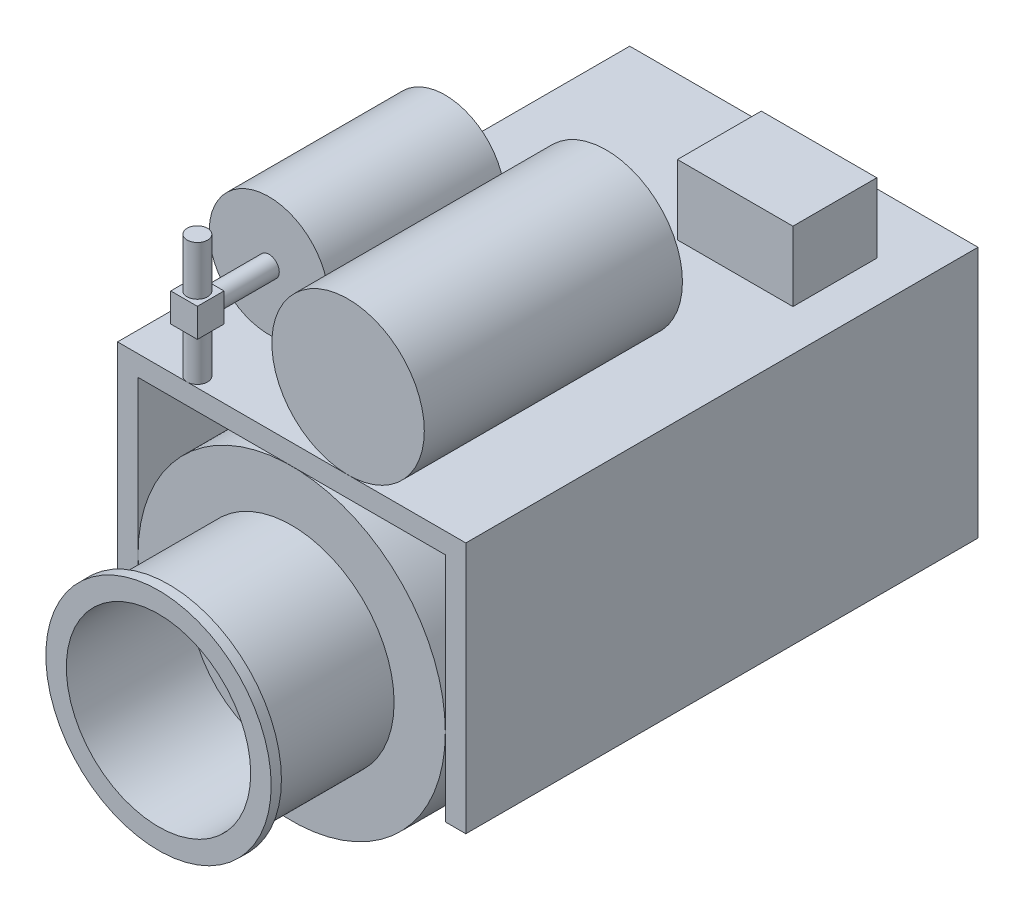
ISO-10303-21;
HEADER;
FILE_DESCRIPTION(('STEP AP214'),'2;1');
FILE_NAME('part.step','',(''),(''),'','','');
FILE_SCHEMA(('AUTOMOTIVE_DESIGN { 1 0 10303 214 1 1 1 1 }'));
ENDSEC;
DATA;
#1=APPLICATION_CONTEXT('core data for automotive mechanical design processes');
#2=APPLICATION_PROTOCOL_DEFINITION('international standard','automotive_design',2000,#1);
#3=PRODUCT_CONTEXT('',#1,'mechanical');
#4=PRODUCT('Part','Part','',(#3));
#5=PRODUCT_RELATED_PRODUCT_CATEGORY('part','',(#4));
#6=PRODUCT_DEFINITION_FORMATION('','',#4);
#7=PRODUCT_DEFINITION_CONTEXT('part definition',#1,'design');
#8=PRODUCT_DEFINITION('design','',#6,#7);
#9=PRODUCT_DEFINITION_SHAPE('','',#8);
#10=(LENGTH_UNIT() NAMED_UNIT(*) SI_UNIT(.MILLI.,.METRE.));
#11=(NAMED_UNIT(*) PLANE_ANGLE_UNIT() SI_UNIT($,.RADIAN.));
#12=(NAMED_UNIT(*) SI_UNIT($,.STERADIAN.) SOLID_ANGLE_UNIT());
#13=UNCERTAINTY_MEASURE_WITH_UNIT(LENGTH_MEASURE(1.E-05),#10,'distance_accuracy_value','');
#14=(GEOMETRIC_REPRESENTATION_CONTEXT(3) GLOBAL_UNCERTAINTY_ASSIGNED_CONTEXT((#13)) GLOBAL_UNIT_ASSIGNED_CONTEXT((#10,
#11,#12)) REPRESENTATION_CONTEXT('',''));
#15=CARTESIAN_POINT('',(0.,0.,0.));
#16=DIRECTION('',(0.,0.,1.));
#17=DIRECTION('',(1.,0.,0.));
#18=AXIS2_PLACEMENT_3D('',#15,#16,#17);
#19=CARTESIAN_POINT('',(-51.1131940651124,114.167789900578,-191.));
#20=DIRECTION('',(0.,0.,1.));
#21=DIRECTION('',(1.,0.,0.));
#22=AXIS2_PLACEMENT_3D('',#19,#20,#21);
#23=CYLINDRICAL_SURFACE('',#22,29.1633630047708);
#24=CARTESIAN_POINT('',(-51.1131940651124,114.167789900578,-191.));
#25=DIRECTION('',(0.,0.,1.));
#26=DIRECTION('',(1.,0.,0.));
#27=AXIS2_PLACEMENT_3D('',#24,#25,#26);
#28=CIRCLE('',#27,29.1633630047708);
#29=CARTESIAN_POINT('',(-21.9498310603416,114.167789900578,-191.));
#30=VERTEX_POINT('',#29);
#31=EDGE_CURVE('E54',#30,#30,#28,.T.);
#32=ORIENTED_EDGE('',*,*,#31,.T.);
#33=EDGE_LOOP('',(#32));
#34=FACE_BOUND('',#33,.T.);
#35=CARTESIAN_POINT('',(-51.1131940651124,114.167789900578,-105.));
#36=DIRECTION('',(0.,0.,1.));
#37=DIRECTION('',(1.,0.,0.));
#38=AXIS2_PLACEMENT_3D('',#35,#36,#37);
#39=CIRCLE('',#38,29.1633630047708);
#40=CARTESIAN_POINT('',(-21.9498310603416,114.167789900578,-105.));
#41=VERTEX_POINT('',#40);
#42=EDGE_CURVE('E49',#41,#41,#39,.T.);
#43=ORIENTED_EDGE('',*,*,#42,.F.);
#44=EDGE_LOOP('',(#43));
#45=FACE_BOUND('',#44,.T.);
#46=ADVANCED_FACE('F46',(#34,#45),#23,.T.);
#47=CARTESIAN_POINT('',(-51.1131940651124,114.167789900578,-191.));
#48=DIRECTION('',(0.,0.,1.));
#49=DIRECTION('',(1.,0.,0.));
#50=AXIS2_PLACEMENT_3D('',#47,#48,#49);
#51=PLANE('',#50);
#52=ORIENTED_EDGE('',*,*,#31,.F.);
#53=EDGE_LOOP('',(#52));
#54=FACE_BOUND('',#53,.T.);
#55=ADVANCED_FACE('F212',(#54),#51,.F.);
#56=CARTESIAN_POINT('',(-51.1131940651124,114.167789900578,-105.));
#57=DIRECTION('',(0.,0.,1.));
#58=DIRECTION('',(1.,0.,0.));
#59=AXIS2_PLACEMENT_3D('',#56,#57,#58);
#60=PLANE('',#59);
#61=CARTESIAN_POINT('',(-51.0528965168359,114.,-105.));
#62=DIRECTION('',(0.,0.,1.));
#63=DIRECTION('',(1.,0.,0.));
#64=AXIS2_PLACEMENT_3D('',#61,#62,#63);
#65=CIRCLE('',#64,5.);
#66=CARTESIAN_POINT('',(-46.0528965168359,114.,-105.));
#67=VERTEX_POINT('',#66);
#68=EDGE_CURVE('E12',#67,#67,#65,.T.);
#69=ORIENTED_EDGE('',*,*,#68,.F.);
#70=EDGE_LOOP('',(#69));
#71=FACE_BOUND('',#70,.T.);
#72=ORIENTED_EDGE('',*,*,#42,.T.);
#73=EDGE_LOOP('',(#72));
#74=FACE_BOUND('',#73,.T.);
#75=ADVANCED_FACE('F209',(#71,#74),#60,.T.);
#76=CARTESIAN_POINT('',(-51.0528965168359,114.,-119.142135623731));
#77=DIRECTION('',(0.,0.,1.));
#78=DIRECTION('',(1.,0.,0.));
#79=AXIS2_PLACEMENT_3D('',#76,#77,#78);
#80=CYLINDRICAL_SURFACE('',#79,5.);
#81=ORIENTED_EDGE('',*,*,#68,.T.);
#82=EDGE_LOOP('',(#81));
#83=FACE_BOUND('',#82,.T.);
#84=CARTESIAN_POINT('',(-51.0528965168359,114.,-76.52));
#85=DIRECTION('',(0.,0.,-1.));
#86=DIRECTION('',(-1.,0.,0.));
#87=AXIS2_PLACEMENT_3D('',#84,#85,#86);
#88=CIRCLE('',#87,5.);
#89=CARTESIAN_POINT('',(-56.0528965168359,114.,-76.52));
#90=VERTEX_POINT('',#89);
#91=EDGE_CURVE('E201',#90,#90,#88,.T.);
#92=ORIENTED_EDGE('',*,*,#91,.T.);
#93=EDGE_LOOP('',(#92));
#94=FACE_BOUND('',#93,.T.);
#95=ADVANCED_FACE('F221',(#83,#94),#80,.T.);
#96=CARTESIAN_POINT('',(85.,85.,-315.));
#97=DIRECTION('',(0.,1.,0.));
#98=DIRECTION('',(0.,0.,1.));
#99=AXIS2_PLACEMENT_3D('',#96,#97,#98);
#100=PLANE('',#99);
#101=CARTESIAN_POINT('',(-51.0528965168359,85.,-70.02));
#102=DIRECTION('',(0.,1.,0.));
#103=DIRECTION('',(0.,0.,1.));
#104=AXIS2_PLACEMENT_3D('',#101,#102,#103);
#105=CIRCLE('',#104,5.);
#106=CARTESIAN_POINT('',(-51.0528965168359,85.,-75.02));
#107=VERTEX_POINT('',#106);
#108=EDGE_CURVE('E197',#107,#107,#105,.T.);
#109=ORIENTED_EDGE('',*,*,#108,.F.);
#110=EDGE_LOOP('',(#109));
#111=FACE_BOUND('',#110,.T.);
#112=DIRECTION('',(0.,0.,1.));
#113=VECTOR('',#112,1.);
#114=CARTESIAN_POINT('',(-85.,85.,-315.));
#115=LINE('',#114,#113);
#116=CARTESIAN_POINT('',(-85.,85.,-315.));
#117=VERTEX_POINT('',#116);
#118=CARTESIAN_POINT('',(-85.,85.,-65.));
#119=VERTEX_POINT('',#118);
#120=EDGE_CURVE('E186',#117,#119,#115,.T.);
#121=ORIENTED_EDGE('',*,*,#120,.T.);
#122=DIRECTION('',(-1.,0.,0.));
#123=VECTOR('',#122,1.);
#124=CARTESIAN_POINT('',(85.,85.,-65.));
#125=LINE('',#124,#123);
#126=CARTESIAN_POINT('',(85.,85.,-65.));
#127=VERTEX_POINT('',#126);
#128=EDGE_CURVE('E170',#127,#119,#125,.T.);
#129=ORIENTED_EDGE('',*,*,#128,.F.);
#130=DIRECTION('',(0.,0.,1.));
#131=VECTOR('',#130,1.);
#132=CARTESIAN_POINT('',(85.,85.,-315.));
#133=LINE('',#132,#131);
#134=CARTESIAN_POINT('',(85.,85.,-315.));
#135=VERTEX_POINT('',#134);
#136=EDGE_CURVE('E189',#135,#127,#133,.T.);
#137=ORIENTED_EDGE('',*,*,#136,.F.);
#138=DIRECTION('',(-1.,0.,0.));
#139=VECTOR('',#138,1.);
#140=CARTESIAN_POINT('',(85.,85.,-315.));
#141=LINE('',#140,#139);
#142=EDGE_CURVE('E155',#135,#117,#141,.T.);
#143=ORIENTED_EDGE('',*,*,#142,.T.);
#144=EDGE_LOOP('',(#121,#129,#137,#143));
#145=FACE_BOUND('',#144,.T.);
#146=DIRECTION('',(1.,0.,0.));
#147=VECTOR('',#146,1.);
#148=CARTESIAN_POINT('',(8.55614973262083,85.,-244.739173744364));
#149=LINE('',#148,#147);
#150=CARTESIAN_POINT('',(8.55614973262083,85.,-244.739173744364));
#151=VERTEX_POINT('',#150);
#152=CARTESIAN_POINT('',(64.9260773828261,85.,-244.739173744364));
#153=VERTEX_POINT('',#152);
#154=EDGE_CURVE('E386',#151,#153,#149,.T.);
#155=ORIENTED_EDGE('',*,*,#154,.F.);
#156=DIRECTION('',(0.,0.,1.));
#157=VECTOR('',#156,1.);
#158=CARTESIAN_POINT('',(8.55614973262083,85.,-244.739173744364));
#159=LINE('',#158,#157);
#160=CARTESIAN_POINT('',(8.55614973262083,85.,-285.674478347489));
#161=VERTEX_POINT('',#160);
#162=EDGE_CURVE('E367',#161,#151,#159,.T.);
#163=ORIENTED_EDGE('',*,*,#162,.F.);
#164=DIRECTION('',(-1.,0.,0.));
#165=VECTOR('',#164,1.);
#166=CARTESIAN_POINT('',(8.55614973262083,85.,-285.674478347489));
#167=LINE('',#166,#165);
#168=CARTESIAN_POINT('',(64.9260773828261,85.,-285.674478347489));
#169=VERTEX_POINT('',#168);
#170=EDGE_CURVE('E374',#169,#161,#167,.T.);
#171=ORIENTED_EDGE('',*,*,#170,.F.);
#172=DIRECTION('',(0.,0.,-1.));
#173=VECTOR('',#172,1.);
#174=CARTESIAN_POINT('',(64.9260773828261,85.,-244.739173744364));
#175=LINE('',#174,#173);
#176=EDGE_CURVE('E389',#153,#169,#175,.T.);
#177=ORIENTED_EDGE('',*,*,#176,.F.);
#178=EDGE_LOOP('',(#155,#163,#171,#177));
#179=FACE_BOUND('',#178,.T.);
#180=ADVANCED_FACE('F226',(#111,#145,#179),#100,.T.);
#181=CARTESIAN_POINT('',(75.,-37.9427434180125,-315.));
#182=DIRECTION('',(-1.,0.,0.));
#183=DIRECTION('',(0.,0.,1.));
#184=AXIS2_PLACEMENT_3D('',#181,#182,#183);
#185=PLANE('',#184);
#186=DIRECTION('',(0.,-1.,0.));
#187=VECTOR('',#186,1.);
#188=CARTESIAN_POINT('',(75.,-37.9427434180125,-65.));
#189=LINE('',#188,#187);
#190=CARTESIAN_POINT('',(75.,75.,-65.));
#191=VERTEX_POINT('',#190);
#192=CARTESIAN_POINT('',(75.,-37.9427434180125,-65.));
#193=VERTEX_POINT('',#192);
#194=EDGE_CURVE('E160',#191,#193,#189,.T.);
#195=ORIENTED_EDGE('',*,*,#194,.F.);
#196=DIRECTION('',(0.,0.,1.));
#197=VECTOR('',#196,1.);
#198=CARTESIAN_POINT('',(75.,75.,-315.));
#199=LINE('',#198,#197);
#200=CARTESIAN_POINT('',(75.,75.,-315.));
#201=VERTEX_POINT('',#200);
#202=EDGE_CURVE('E71',#201,#191,#199,.T.);
#203=ORIENTED_EDGE('',*,*,#202,.F.);
#204=DIRECTION('',(0.,-1.,0.));
#205=VECTOR('',#204,1.);
#206=CARTESIAN_POINT('',(75.,-37.9427434180125,-315.));
#207=LINE('',#206,#205);
#208=CARTESIAN_POINT('',(75.,-37.9427434180125,-315.));
#209=VERTEX_POINT('',#208);
#210=EDGE_CURVE('E181',#201,#209,#207,.T.);
#211=ORIENTED_EDGE('',*,*,#210,.T.);
#212=DIRECTION('',(0.,0.,1.));
#213=VECTOR('',#212,1.);
#214=CARTESIAN_POINT('',(75.,-37.9427434180125,-315.));
#215=LINE('',#214,#213);
#216=EDGE_CURVE('E110',#209,#193,#215,.T.);
#217=ORIENTED_EDGE('',*,*,#216,.T.);
#218=EDGE_LOOP('',(#195,#203,#211,#217));
#219=FACE_BOUND('',#218,.T.);
#220=ADVANCED_FACE('F228',(#219),#185,.T.);
#221=CARTESIAN_POINT('',(75.,75.,-315.));
#222=DIRECTION('',(0.,-1.,0.));
#223=DIRECTION('',(0.,0.,-1.));
#224=AXIS2_PLACEMENT_3D('',#221,#222,#223);
#225=PLANE('',#224);
#226=DIRECTION('',(1.,0.,0.));
#227=VECTOR('',#226,1.);
#228=CARTESIAN_POINT('',(75.,75.,-65.));
#229=LINE('',#228,#227);
#230=CARTESIAN_POINT('',(-75.,75.,-65.));
#231=VERTEX_POINT('',#230);
#232=EDGE_CURVE('E178',#231,#191,#229,.T.);
#233=ORIENTED_EDGE('',*,*,#232,.F.);
#234=DIRECTION('',(0.,0.,1.));
#235=VECTOR('',#234,1.);
#236=CARTESIAN_POINT('',(-75.,75.,-315.));
#237=LINE('',#236,#235);
#238=CARTESIAN_POINT('',(-75.,75.,-315.));
#239=VERTEX_POINT('',#238);
#240=EDGE_CURVE('E141',#239,#231,#237,.T.);
#241=ORIENTED_EDGE('',*,*,#240,.F.);
#242=DIRECTION('',(1.,0.,0.));
#243=VECTOR('',#242,1.);
#244=CARTESIAN_POINT('',(75.,75.,-315.));
#245=LINE('',#244,#243);
#246=EDGE_CURVE('E150',#239,#201,#245,.T.);
#247=ORIENTED_EDGE('',*,*,#246,.T.);
#248=ORIENTED_EDGE('',*,*,#202,.T.);
#249=EDGE_LOOP('',(#233,#241,#247,#248));
#250=FACE_BOUND('',#249,.T.);
#251=ADVANCED_FACE('F231',(#250),#225,.T.);
#252=CARTESIAN_POINT('',(-75.,75.,-315.));
#253=DIRECTION('',(1.,0.,0.));
#254=DIRECTION('',(0.,0.,-1.));
#255=AXIS2_PLACEMENT_3D('',#252,#253,#254);
#256=PLANE('',#255);
#257=DIRECTION('',(0.,1.,0.));
#258=VECTOR('',#257,1.);
#259=CARTESIAN_POINT('',(-75.,75.,-65.));
#260=LINE('',#259,#258);
#261=CARTESIAN_POINT('',(-75.,-37.9427434180125,-65.));
#262=VERTEX_POINT('',#261);
#263=EDGE_CURVE('E136',#262,#231,#260,.T.);
#264=ORIENTED_EDGE('',*,*,#263,.F.);
#265=DIRECTION('',(0.,0.,1.));
#266=VECTOR('',#265,1.);
#267=CARTESIAN_POINT('',(-75.,-37.9427434180125,-315.));
#268=LINE('',#267,#266);
#269=CARTESIAN_POINT('',(-75.,-37.9427434180125,-315.));
#270=VERTEX_POINT('',#269);
#271=EDGE_CURVE('E130',#270,#262,#268,.T.);
#272=ORIENTED_EDGE('',*,*,#271,.F.);
#273=DIRECTION('',(0.,1.,0.));
#274=VECTOR('',#273,1.);
#275=CARTESIAN_POINT('',(-75.,75.,-315.));
#276=LINE('',#275,#274);
#277=EDGE_CURVE('E133',#270,#239,#276,.T.);
#278=ORIENTED_EDGE('',*,*,#277,.T.);
#279=ORIENTED_EDGE('',*,*,#240,.T.);
#280=EDGE_LOOP('',(#264,#272,#278,#279));
#281=FACE_BOUND('',#280,.T.);
#282=ADVANCED_FACE('F132',(#281),#256,.T.);
#283=CARTESIAN_POINT('',(-75.,-37.9427434180125,-315.));
#284=DIRECTION('',(0.,-1.,0.));
#285=DIRECTION('',(0.,0.,-1.));
#286=AXIS2_PLACEMENT_3D('',#283,#284,#285);
#287=PLANE('',#286);
#288=DIRECTION('',(1.,0.,0.));
#289=VECTOR('',#288,1.);
#290=CARTESIAN_POINT('',(-75.,-37.9427434180125,-65.));
#291=LINE('',#290,#289);
#292=CARTESIAN_POINT('',(-85.,-37.9427434180125,-65.));
#293=VERTEX_POINT('',#292);
#294=EDGE_CURVE('E175',#293,#262,#291,.T.);
#295=ORIENTED_EDGE('',*,*,#294,.F.);
#296=DIRECTION('',(0.,0.,1.));
#297=VECTOR('',#296,1.);
#298=CARTESIAN_POINT('',(-85.,-37.9427434180125,-315.));
#299=LINE('',#298,#297);
#300=CARTESIAN_POINT('',(-85.,-37.9427434180125,-315.));
#301=VERTEX_POINT('',#300);
#302=EDGE_CURVE('E142',#301,#293,#299,.T.);
#303=ORIENTED_EDGE('',*,*,#302,.F.);
#304=DIRECTION('',(1.,0.,0.));
#305=VECTOR('',#304,1.);
#306=CARTESIAN_POINT('',(-75.,-37.9427434180125,-315.));
#307=LINE('',#306,#305);
#308=EDGE_CURVE('E148',#301,#270,#307,.T.);
#309=ORIENTED_EDGE('',*,*,#308,.T.);
#310=ORIENTED_EDGE('',*,*,#271,.T.);
#311=EDGE_LOOP('',(#295,#303,#309,#310));
#312=FACE_BOUND('',#311,.T.);
#313=ADVANCED_FACE('F152',(#312),#287,.T.);
#314=CARTESIAN_POINT('',(-85.,85.,-315.));
#315=DIRECTION('',(-1.,0.,0.));
#316=DIRECTION('',(0.,0.,1.));
#317=AXIS2_PLACEMENT_3D('',#314,#315,#316);
#318=PLANE('',#317);
#319=DIRECTION('',(0.,-1.,0.));
#320=VECTOR('',#319,1.);
#321=CARTESIAN_POINT('',(-85.,85.,-65.));
#322=LINE('',#321,#320);
#323=EDGE_CURVE('E172',#119,#293,#322,.T.);
#324=ORIENTED_EDGE('',*,*,#323,.F.);
#325=ORIENTED_EDGE('',*,*,#120,.F.);
#326=DIRECTION('',(0.,-1.,0.));
#327=VECTOR('',#326,1.);
#328=CARTESIAN_POINT('',(-85.,85.,-315.));
#329=LINE('',#328,#327);
#330=EDGE_CURVE('E153',#117,#301,#329,.T.);
#331=ORIENTED_EDGE('',*,*,#330,.T.);
#332=ORIENTED_EDGE('',*,*,#302,.T.);
#333=EDGE_LOOP('',(#324,#325,#331,#332));
#334=FACE_BOUND('',#333,.T.);
#335=ADVANCED_FACE('F238',(#334),#318,.T.);
#336=CARTESIAN_POINT('',(85.,-37.9427434180125,-315.));
#337=DIRECTION('',(1.,0.,0.));
#338=DIRECTION('',(0.,0.,-1.));
#339=AXIS2_PLACEMENT_3D('',#336,#337,#338);
#340=PLANE('',#339);
#341=DIRECTION('',(0.,1.,0.));
#342=VECTOR('',#341,1.);
#343=CARTESIAN_POINT('',(85.,-37.9427434180125,-65.));
#344=LINE('',#343,#342);
#345=CARTESIAN_POINT('',(85.,-37.9427434180125,-65.));
#346=VERTEX_POINT('',#345);
#347=EDGE_CURVE('E167',#346,#127,#344,.T.);
#348=ORIENTED_EDGE('',*,*,#347,.F.);
#349=DIRECTION('',(0.,0.,1.));
#350=VECTOR('',#349,1.);
#351=CARTESIAN_POINT('',(85.,-37.9427434180125,-315.));
#352=LINE('',#351,#350);
#353=CARTESIAN_POINT('',(85.,-37.9427434180125,-315.));
#354=VERTEX_POINT('',#353);
#355=EDGE_CURVE('E191',#354,#346,#352,.T.);
#356=ORIENTED_EDGE('',*,*,#355,.F.);
#357=DIRECTION('',(0.,1.,0.));
#358=VECTOR('',#357,1.);
#359=CARTESIAN_POINT('',(85.,-37.9427434180125,-315.));
#360=LINE('',#359,#358);
#361=EDGE_CURVE('E403',#354,#135,#360,.T.);
#362=ORIENTED_EDGE('',*,*,#361,.T.);
#363=ORIENTED_EDGE('',*,*,#136,.T.);
#364=EDGE_LOOP('',(#348,#356,#362,#363));
#365=FACE_BOUND('',#364,.T.);
#366=ADVANCED_FACE('F235',(#365),#340,.T.);
#367=CARTESIAN_POINT('',(75.,-37.9427434180125,-315.));
#368=DIRECTION('',(0.,-1.,0.));
#369=DIRECTION('',(0.,0.,-1.));
#370=AXIS2_PLACEMENT_3D('',#367,#368,#369);
#371=PLANE('',#370);
#372=DIRECTION('',(1.,0.,0.));
#373=VECTOR('',#372,1.);
#374=CARTESIAN_POINT('',(75.,-37.9427434180125,-65.));
#375=LINE('',#374,#373);
#376=EDGE_CURVE('E163',#193,#346,#375,.T.);
#377=ORIENTED_EDGE('',*,*,#376,.F.);
#378=ORIENTED_EDGE('',*,*,#216,.F.);
#379=DIRECTION('',(1.,0.,0.));
#380=VECTOR('',#379,1.);
#381=CARTESIAN_POINT('',(75.,-37.9427434180125,-315.));
#382=LINE('',#381,#380);
#383=EDGE_CURVE('E401',#209,#354,#382,.T.);
#384=ORIENTED_EDGE('',*,*,#383,.T.);
#385=ORIENTED_EDGE('',*,*,#355,.T.);
#386=EDGE_LOOP('',(#377,#378,#384,#385));
#387=FACE_BOUND('',#386,.T.);
#388=ADVANCED_FACE('F232',(#387),#371,.T.);
#389=CARTESIAN_POINT('',(0.,0.,-315.));
#390=DIRECTION('',(0.,0.,1.));
#391=DIRECTION('',(1.,0.,0.));
#392=AXIS2_PLACEMENT_3D('',#389,#390,#391);
#393=PLANE('',#392);
#394=ORIENTED_EDGE('',*,*,#210,.F.);
#395=ORIENTED_EDGE('',*,*,#246,.F.);
#396=ORIENTED_EDGE('',*,*,#277,.F.);
#397=ORIENTED_EDGE('',*,*,#308,.F.);
#398=ORIENTED_EDGE('',*,*,#330,.F.);
#399=ORIENTED_EDGE('',*,*,#142,.F.);
#400=ORIENTED_EDGE('',*,*,#361,.F.);
#401=ORIENTED_EDGE('',*,*,#383,.F.);
#402=EDGE_LOOP('',(#394,#395,#396,#397,#398,#399,#400,#401));
#403=FACE_BOUND('',#402,.T.);
#404=ADVANCED_FACE('F146',(#403),#393,.F.);
#405=CARTESIAN_POINT('',(0.,0.,-65.));
#406=DIRECTION('',(0.,0.,1.));
#407=DIRECTION('',(1.,0.,0.));
#408=AXIS2_PLACEMENT_3D('',#405,#406,#407);
#409=PLANE('',#408);
#410=ORIENTED_EDGE('',*,*,#194,.T.);
#411=ORIENTED_EDGE('',*,*,#376,.T.);
#412=ORIENTED_EDGE('',*,*,#347,.T.);
#413=ORIENTED_EDGE('',*,*,#128,.T.);
#414=ORIENTED_EDGE('',*,*,#323,.T.);
#415=ORIENTED_EDGE('',*,*,#294,.T.);
#416=ORIENTED_EDGE('',*,*,#263,.T.);
#417=ORIENTED_EDGE('',*,*,#232,.T.);
#418=EDGE_LOOP('',(#410,#411,#412,#413,#414,#415,#416,#417));
#419=FACE_BOUND('',#418,.T.);
#420=ADVANCED_FACE('F252',(#419),#409,.T.);
#421=CARTESIAN_POINT('',(8.55614973262083,119.,-244.739173744364));
#422=DIRECTION('',(1.,0.,0.));
#423=DIRECTION('',(0.,0.,-1.));
#424=AXIS2_PLACEMENT_3D('',#421,#422,#423);
#425=PLANE('',#424);
#426=ORIENTED_EDGE('',*,*,#162,.T.);
#427=DIRECTION('',(0.,-1.,0.));
#428=VECTOR('',#427,1.);
#429=CARTESIAN_POINT('',(8.55614973262083,119.,-244.739173744364));
#430=LINE('',#429,#428);
#431=CARTESIAN_POINT('',(8.55614973262083,119.,-244.739173744364));
#432=VERTEX_POINT('',#431);
#433=EDGE_CURVE('E164',#432,#151,#430,.T.);
#434=ORIENTED_EDGE('',*,*,#433,.F.);
#435=DIRECTION('',(0.,0.,1.));
#436=VECTOR('',#435,1.);
#437=CARTESIAN_POINT('',(8.55614973262083,119.,-244.739173744364));
#438=LINE('',#437,#436);
#439=CARTESIAN_POINT('',(8.55614973262083,119.,-285.674478347489));
#440=VERTEX_POINT('',#439);
#441=EDGE_CURVE('E370',#440,#432,#438,.T.);
#442=ORIENTED_EDGE('',*,*,#441,.F.);
#443=DIRECTION('',(0.,-1.,0.));
#444=VECTOR('',#443,1.);
#445=CARTESIAN_POINT('',(8.55614973262083,119.,-285.674478347489));
#446=LINE('',#445,#444);
#447=EDGE_CURVE('E383',#440,#161,#446,.T.);
#448=ORIENTED_EDGE('',*,*,#447,.T.);
#449=EDGE_LOOP('',(#426,#434,#442,#448));
#450=FACE_BOUND('',#449,.T.);
#451=ADVANCED_FACE('F255',(#450),#425,.F.);
#452=CARTESIAN_POINT('',(8.55614973262083,119.,-244.739173744364));
#453=DIRECTION('',(0.,0.,-1.));
#454=DIRECTION('',(-1.,0.,0.));
#455=AXIS2_PLACEMENT_3D('',#452,#453,#454);
#456=PLANE('',#455);
#457=ORIENTED_EDGE('',*,*,#154,.T.);
#458=DIRECTION('',(0.,-1.,0.));
#459=VECTOR('',#458,1.);
#460=CARTESIAN_POINT('',(64.9260773828261,119.,-244.739173744364));
#461=LINE('',#460,#459);
#462=CARTESIAN_POINT('',(64.9260773828261,119.,-244.739173744364));
#463=VERTEX_POINT('',#462);
#464=EDGE_CURVE('E395',#463,#153,#461,.T.);
#465=ORIENTED_EDGE('',*,*,#464,.F.);
#466=DIRECTION('',(1.,0.,0.));
#467=VECTOR('',#466,1.);
#468=CARTESIAN_POINT('',(8.55614973262083,119.,-244.739173744364));
#469=LINE('',#468,#467);
#470=EDGE_CURVE('E373',#432,#463,#469,.T.);
#471=ORIENTED_EDGE('',*,*,#470,.F.);
#472=ORIENTED_EDGE('',*,*,#433,.T.);
#473=EDGE_LOOP('',(#457,#465,#471,#472));
#474=FACE_BOUND('',#473,.T.);
#475=ADVANCED_FACE('F261',(#474),#456,.F.);
#476=CARTESIAN_POINT('',(64.9260773828261,119.,-244.739173744364));
#477=DIRECTION('',(-1.,0.,0.));
#478=DIRECTION('',(0.,0.,1.));
#479=AXIS2_PLACEMENT_3D('',#476,#477,#478);
#480=PLANE('',#479);
#481=ORIENTED_EDGE('',*,*,#176,.T.);
#482=DIRECTION('',(0.,-1.,0.));
#483=VECTOR('',#482,1.);
#484=CARTESIAN_POINT('',(64.9260773828261,119.,-285.674478347489));
#485=LINE('',#484,#483);
#486=CARTESIAN_POINT('',(64.9260773828261,119.,-285.674478347489));
#487=VERTEX_POINT('',#486);
#488=EDGE_CURVE('E62',#487,#169,#485,.T.);
#489=ORIENTED_EDGE('',*,*,#488,.F.);
#490=DIRECTION('',(0.,0.,-1.));
#491=VECTOR('',#490,1.);
#492=CARTESIAN_POINT('',(64.9260773828261,119.,-244.739173744364));
#493=LINE('',#492,#491);
#494=EDGE_CURVE('E377',#463,#487,#493,.T.);
#495=ORIENTED_EDGE('',*,*,#494,.F.);
#496=ORIENTED_EDGE('',*,*,#464,.T.);
#497=EDGE_LOOP('',(#481,#489,#495,#496));
#498=FACE_BOUND('',#497,.T.);
#499=ADVANCED_FACE('F265',(#498),#480,.F.);
#500=CARTESIAN_POINT('',(8.55614973262083,119.,-285.674478347489));
#501=DIRECTION('',(0.,0.,1.));
#502=DIRECTION('',(1.,0.,0.));
#503=AXIS2_PLACEMENT_3D('',#500,#501,#502);
#504=PLANE('',#503);
#505=ORIENTED_EDGE('',*,*,#170,.T.);
#506=ORIENTED_EDGE('',*,*,#447,.F.);
#507=DIRECTION('',(-1.,0.,0.));
#508=VECTOR('',#507,1.);
#509=CARTESIAN_POINT('',(8.55614973262083,119.,-285.674478347489));
#510=LINE('',#509,#508);
#511=EDGE_CURVE('E380',#487,#440,#510,.T.);
#512=ORIENTED_EDGE('',*,*,#511,.F.);
#513=ORIENTED_EDGE('',*,*,#488,.T.);
#514=EDGE_LOOP('',(#505,#506,#512,#513));
#515=FACE_BOUND('',#514,.T.);
#516=ADVANCED_FACE('F269',(#515),#504,.F.);
#517=CARTESIAN_POINT('',(0.,119.,0.));
#518=DIRECTION('',(0.,-1.,0.));
#519=DIRECTION('',(0.,0.,-1.));
#520=AXIS2_PLACEMENT_3D('',#517,#518,#519);
#521=PLANE('',#520);
#522=ORIENTED_EDGE('',*,*,#441,.T.);
#523=ORIENTED_EDGE('',*,*,#470,.T.);
#524=ORIENTED_EDGE('',*,*,#494,.T.);
#525=ORIENTED_EDGE('',*,*,#511,.T.);
#526=EDGE_LOOP('',(#522,#523,#524,#525));
#527=FACE_BOUND('',#526,.T.);
#528=ADVANCED_FACE('F273',(#527),#521,.F.);
#529=CARTESIAN_POINT('',(-51.0528965168359,145.,-70.02));
#530=DIRECTION('',(0.,-1.,0.));
#531=DIRECTION('',(0.,0.,-1.));
#532=AXIS2_PLACEMENT_3D('',#529,#530,#531);
#533=CYLINDRICAL_SURFACE('',#532,5.);
#534=CARTESIAN_POINT('',(-51.0528965168359,107.,-70.02));
#535=DIRECTION('',(0.,-1.,0.));
#536=DIRECTION('',(0.,0.,-1.));
#537=AXIS2_PLACEMENT_3D('',#534,#535,#536);
#538=CIRCLE('',#537,5.);
#539=CARTESIAN_POINT('',(-51.0528965168359,107.,-75.02));
#540=VERTEX_POINT('',#539);
#541=EDGE_CURVE('E194',#540,#540,#538,.T.);
#542=CARTESIAN_POINT('',(-51.0528965168359,107.,-75.02));
#543=CARTESIAN_POINT('',(-51.0528965168359,106.770833333333,-75.02));
#544=CARTESIAN_POINT('',(-51.0528965168359,106.541666666667,-75.02));
#545=CARTESIAN_POINT('',(-51.0528965168359,106.083333333333,-75.02));
#546=CARTESIAN_POINT('',(-51.0528965168359,105.854166666667,-75.02));
#547=CARTESIAN_POINT('',(-51.0528965168359,105.395833333333,-75.02));
#548=CARTESIAN_POINT('',(-51.0528965168359,105.166666666667,-75.02));
#549=CARTESIAN_POINT('',(-51.0528965168359,104.708333333333,-75.02));
#550=CARTESIAN_POINT('',(-51.0528965168359,104.479166666667,-75.02));
#551=CARTESIAN_POINT('',(-51.0528965168359,104.020833333333,-75.02));
#552=CARTESIAN_POINT('',(-51.0528965168359,103.791666666667,-75.02));
#553=CARTESIAN_POINT('',(-51.0528965168359,103.333333333333,-75.02));
#554=CARTESIAN_POINT('',(-51.0528965168359,103.104166666667,-75.02));
#555=CARTESIAN_POINT('',(-51.0528965168359,102.645833333333,-75.02));
#556=CARTESIAN_POINT('',(-51.0528965168359,102.416666666667,-75.02));
#557=CARTESIAN_POINT('',(-51.0528965168359,101.958333333333,-75.02));
#558=CARTESIAN_POINT('',(-51.0528965168359,101.729166666667,-75.02));
#559=CARTESIAN_POINT('',(-51.0528965168359,101.270833333333,-75.02));
#560=CARTESIAN_POINT('',(-51.0528965168359,101.041666666667,-75.02));
#561=CARTESIAN_POINT('',(-51.0528965168359,100.583333333333,-75.02));
#562=CARTESIAN_POINT('',(-51.0528965168359,100.354166666667,-75.02));
#563=CARTESIAN_POINT('',(-51.0528965168359,99.8958333333333,-75.02));
#564=CARTESIAN_POINT('',(-51.0528965168359,99.6666666666666,-75.02));
#565=CARTESIAN_POINT('',(-51.0528965168359,99.2083333333333,-75.02));
#566=CARTESIAN_POINT('',(-51.0528965168359,98.9791666666666,-75.02));
#567=CARTESIAN_POINT('',(-51.0528965168359,98.5208333333333,-75.02));
#568=CARTESIAN_POINT('',(-51.0528965168359,98.2916666666666,-75.02));
#569=CARTESIAN_POINT('',(-51.0528965168359,97.8333333333333,-75.02));
#570=CARTESIAN_POINT('',(-51.0528965168359,97.6041666666666,-75.02));
#571=CARTESIAN_POINT('',(-51.0528965168359,97.1458333333333,-75.02));
#572=CARTESIAN_POINT('',(-51.0528965168359,96.9166666666666,-75.02));
#573=CARTESIAN_POINT('',(-51.0528965168359,96.4583333333333,-75.02));
#574=CARTESIAN_POINT('',(-51.0528965168359,96.2291666666666,-75.02));
#575=CARTESIAN_POINT('',(-51.0528965168359,95.7708333333333,-75.02));
#576=CARTESIAN_POINT('',(-51.0528965168359,95.5416666666666,-75.02));
#577=CARTESIAN_POINT('',(-51.0528965168359,95.0833333333333,-75.02));
#578=CARTESIAN_POINT('',(-51.0528965168359,94.8541666666666,-75.02));
#579=CARTESIAN_POINT('',(-51.0528965168359,94.3958333333333,-75.02));
#580=CARTESIAN_POINT('',(-51.0528965168359,94.1666666666666,-75.02));
#581=CARTESIAN_POINT('',(-51.0528965168359,93.7083333333333,-75.02));
#582=CARTESIAN_POINT('',(-51.0528965168359,93.4791666666666,-75.02));
#583=CARTESIAN_POINT('',(-51.0528965168359,93.0208333333333,-75.02));
#584=CARTESIAN_POINT('',(-51.0528965168359,92.7916666666666,-75.02));
#585=CARTESIAN_POINT('',(-51.0528965168359,92.3333333333333,-75.02));
#586=CARTESIAN_POINT('',(-51.0528965168359,92.1041666666667,-75.02));
#587=CARTESIAN_POINT('',(-51.0528965168359,91.6458333333333,-75.02));
#588=CARTESIAN_POINT('',(-51.0528965168359,91.4166666666666,-75.02));
#589=CARTESIAN_POINT('',(-51.0528965168359,90.9583333333333,-75.02));
#590=CARTESIAN_POINT('',(-51.0528965168359,90.7291666666667,-75.02));
#591=CARTESIAN_POINT('',(-51.0528965168359,90.2708333333333,-75.02));
#592=CARTESIAN_POINT('',(-51.0528965168359,90.0416666666667,-75.02));
#593=CARTESIAN_POINT('',(-51.0528965168359,89.5833333333333,-75.02));
#594=CARTESIAN_POINT('',(-51.0528965168359,89.3541666666667,-75.02));
#595=CARTESIAN_POINT('',(-51.0528965168359,88.8958333333333,-75.02));
#596=CARTESIAN_POINT('',(-51.0528965168359,88.6666666666667,-75.02));
#597=CARTESIAN_POINT('',(-51.0528965168359,88.2083333333333,-75.02));
#598=CARTESIAN_POINT('',(-51.0528965168359,87.9791666666667,-75.02));
#599=CARTESIAN_POINT('',(-51.0528965168359,87.5208333333333,-75.02));
#600=CARTESIAN_POINT('',(-51.0528965168359,87.2916666666667,-75.02));
#601=CARTESIAN_POINT('',(-51.0528965168359,86.8333333333333,-75.02));
#602=CARTESIAN_POINT('',(-51.0528965168359,86.6041666666667,-75.02));
#603=CARTESIAN_POINT('',(-51.0528965168359,86.1458333333333,-75.02));
#604=CARTESIAN_POINT('',(-51.0528965168359,85.9166666666667,-75.02));
#605=CARTESIAN_POINT('',(-51.0528965168359,85.4583333333333,-75.02));
#606=CARTESIAN_POINT('',(-51.0528965168359,85.2291666666667,-75.02));
#607=CARTESIAN_POINT('',(-51.0528965168359,85.,-75.02));
#608=B_SPLINE_CURVE_WITH_KNOTS('',3,(#542,#543,#544,#545,#546,#547,#548,#549,#550,#551,#552,
#553,#554,#555,#556,#557,#558,#559,#560,#561,#562,#563,#564,#565,#566,#567,#568,#569,#570,#571,
#572,#573,#574,#575,#576,#577,#578,#579,#580,#581,#582,#583,#584,#585,#586,#587,#588,#589,#590,
#591,#592,#593,#594,#595,#596,#597,#598,#599,#600,#601,#602,#603,#604,#605,#606,#607),
.UNSPECIFIED.,.F.,.F.,(4,2,2,2,2,2,2,2,2,2,2,2,2,2,2,2,2,2,2,2,2,2,2,2,2,2,2,2,2,2,2,2,4),(0.,
0.687499999999994,1.37499999999999,2.06249999999999,2.74999999999997,3.43749999999998,
4.12499999999999,4.81249999999997,5.49999999999998,6.18749999999998,6.87499999999996,
7.56249999999997,8.24999999999998,8.93749999999996,9.62499999999997,10.3125,11.,11.6875,12.375,
13.0624999999999,13.75,14.4375,15.1249999999999,15.8125,16.4999999999999,17.1874999999999,
17.8749999999999,18.5624999999999,19.2499999999999,19.9374999999999,20.6249999999999,
21.3124999999999,21.9999999999999),.UNSPECIFIED.);
#609=EDGE_CURVE('BSEAM276',#540,#107,#608,.T.);
#610=ORIENTED_EDGE('',*,*,#541,.T.);
#611=ORIENTED_EDGE('',*,*,#108,.T.);
#612=ORIENTED_EDGE('',*,*,#609,.T.);
#613=ORIENTED_EDGE('',*,*,#609,.F.);
#614=EDGE_LOOP('',(#610,#612,#611,#613));
#615=FACE_BOUND('',#614,.T.);
#616=ADVANCED_FACE('F276',(#615),#533,.T.);
#617=CARTESIAN_POINT('',(-44.5528965168358,121.,-63.52));
#618=DIRECTION('',(0.,0.,-1.));
#619=DIRECTION('',(-1.,0.,0.));
#620=AXIS2_PLACEMENT_3D('',#617,#618,#619);
#621=PLANE('',#620);
#622=DIRECTION('',(0.,-1.,0.));
#623=VECTOR('',#622,1.);
#624=CARTESIAN_POINT('',(-57.5528965168359,121.,-63.52));
#625=LINE('',#624,#623);
#626=CARTESIAN_POINT('',(-57.5528965168359,121.,-63.52));
#627=VERTEX_POINT('',#626);
#628=CARTESIAN_POINT('',(-57.5528965168359,107.,-63.52));
#629=VERTEX_POINT('',#628);
#630=EDGE_CURVE('E198',#627,#629,#625,.T.);
#631=ORIENTED_EDGE('',*,*,#630,.T.);
#632=DIRECTION('',(1.,0.,0.));
#633=VECTOR('',#632,1.);
#634=CARTESIAN_POINT('',(-44.5528965168358,107.,-63.52));
#635=LINE('',#634,#633);
#636=CARTESIAN_POINT('',(-44.5528965168358,107.,-63.52));
#637=VERTEX_POINT('',#636);
#638=EDGE_CURVE('E326',#629,#637,#635,.T.);
#639=ORIENTED_EDGE('',*,*,#638,.T.);
#640=DIRECTION('',(0.,-1.,0.));
#641=VECTOR('',#640,1.);
#642=CARTESIAN_POINT('',(-44.5528965168358,121.,-63.52));
#643=LINE('',#642,#641);
#644=CARTESIAN_POINT('',(-44.5528965168358,121.,-63.52));
#645=VERTEX_POINT('',#644);
#646=EDGE_CURVE('E359',#645,#637,#643,.T.);
#647=ORIENTED_EDGE('',*,*,#646,.F.);
#648=DIRECTION('',(1.,0.,0.));
#649=VECTOR('',#648,1.);
#650=CARTESIAN_POINT('',(-44.5528965168358,121.,-63.52));
#651=LINE('',#650,#649);
#652=EDGE_CURVE('E344',#627,#645,#651,.T.);
#653=ORIENTED_EDGE('',*,*,#652,.F.);
#654=EDGE_LOOP('',(#631,#639,#647,#653));
#655=FACE_BOUND('',#654,.T.);
#656=ADVANCED_FACE('F280',(#655),#621,.F.);
#657=CARTESIAN_POINT('',(-44.5528965168358,121.,-76.52));
#658=DIRECTION('',(-1.,0.,0.));
#659=DIRECTION('',(0.,0.,1.));
#660=AXIS2_PLACEMENT_3D('',#657,#658,#659);
#661=PLANE('',#660);
#662=ORIENTED_EDGE('',*,*,#646,.T.);
#663=DIRECTION('',(0.,0.,-1.));
#664=VECTOR('',#663,1.);
#665=CARTESIAN_POINT('',(-44.5528965168358,107.,-76.52));
#666=LINE('',#665,#664);
#667=CARTESIAN_POINT('',(-44.5528965168358,107.,-76.52));
#668=VERTEX_POINT('',#667);
#669=EDGE_CURVE('E341',#637,#668,#666,.T.);
#670=ORIENTED_EDGE('',*,*,#669,.T.);
#671=DIRECTION('',(0.,-1.,0.));
#672=VECTOR('',#671,1.);
#673=CARTESIAN_POINT('',(-44.5528965168358,121.,-76.52));
#674=LINE('',#673,#672);
#675=CARTESIAN_POINT('',(-44.5528965168358,121.,-76.52));
#676=VERTEX_POINT('',#675);
#677=EDGE_CURVE('E339',#676,#668,#674,.T.);
#678=ORIENTED_EDGE('',*,*,#677,.F.);
#679=DIRECTION('',(0.,0.,-1.));
#680=VECTOR('',#679,1.);
#681=CARTESIAN_POINT('',(-44.5528965168358,121.,-76.52));
#682=LINE('',#681,#680);
#683=EDGE_CURVE('E351',#645,#676,#682,.T.);
#684=ORIENTED_EDGE('',*,*,#683,.F.);
#685=EDGE_LOOP('',(#662,#670,#678,#684));
#686=FACE_BOUND('',#685,.T.);
#687=ADVANCED_FACE('F290',(#686),#661,.F.);
#688=CARTESIAN_POINT('',(-57.5528965168359,121.,-76.52));
#689=DIRECTION('',(0.,0.,1.));
#690=DIRECTION('',(1.,0.,0.));
#691=AXIS2_PLACEMENT_3D('',#688,#689,#690);
#692=PLANE('',#691);
#693=ORIENTED_EDGE('',*,*,#91,.F.);
#694=EDGE_LOOP('',(#693));
#695=FACE_BOUND('',#694,.T.);
#696=ORIENTED_EDGE('',*,*,#677,.T.);
#697=DIRECTION('',(-1.,0.,0.));
#698=VECTOR('',#697,1.);
#699=CARTESIAN_POINT('',(-57.5528965168359,107.,-76.52));
#700=LINE('',#699,#698);
#701=CARTESIAN_POINT('',(-57.5528965168359,107.,-76.52));
#702=VERTEX_POINT('',#701);
#703=EDGE_CURVE('E322',#668,#702,#700,.T.);
#704=ORIENTED_EDGE('',*,*,#703,.T.);
#705=DIRECTION('',(0.,-1.,0.));
#706=VECTOR('',#705,1.);
#707=CARTESIAN_POINT('',(-57.5528965168359,121.,-76.52));
#708=LINE('',#707,#706);
#709=CARTESIAN_POINT('',(-57.5528965168359,121.,-76.52));
#710=VERTEX_POINT('',#709);
#711=EDGE_CURVE('E337',#710,#702,#708,.T.);
#712=ORIENTED_EDGE('',*,*,#711,.F.);
#713=DIRECTION('',(-1.,0.,0.));
#714=VECTOR('',#713,1.);
#715=CARTESIAN_POINT('',(-57.5528965168359,121.,-76.52));
#716=LINE('',#715,#714);
#717=EDGE_CURVE('E354',#676,#710,#716,.T.);
#718=ORIENTED_EDGE('',*,*,#717,.F.);
#719=EDGE_LOOP('',(#696,#704,#712,#718));
#720=FACE_BOUND('',#719,.T.);
#721=ADVANCED_FACE('F294',(#695,#720),#692,.F.);
#722=CARTESIAN_POINT('',(-57.5528965168359,121.,-70.02));
#723=DIRECTION('',(1.,0.,0.));
#724=DIRECTION('',(0.,0.,-1.));
#725=AXIS2_PLACEMENT_3D('',#722,#723,#724);
#726=PLANE('',#725);
#727=ORIENTED_EDGE('',*,*,#711,.T.);
#728=DIRECTION('',(0.,0.,1.));
#729=VECTOR('',#728,1.);
#730=CARTESIAN_POINT('',(-57.5528965168359,107.,-63.52));
#731=LINE('',#730,#729);
#732=EDGE_CURVE('E318',#702,#629,#731,.T.);
#733=ORIENTED_EDGE('',*,*,#732,.T.);
#734=ORIENTED_EDGE('',*,*,#630,.F.);
#735=DIRECTION('',(0.,0.,1.));
#736=VECTOR('',#735,1.);
#737=CARTESIAN_POINT('',(-57.5528965168359,121.,-63.52));
#738=LINE('',#737,#736);
#739=EDGE_CURVE('E340',#710,#627,#738,.T.);
#740=ORIENTED_EDGE('',*,*,#739,.F.);
#741=EDGE_LOOP('',(#727,#733,#734,#740));
#742=FACE_BOUND('',#741,.T.);
#743=ADVANCED_FACE('F298',(#742),#726,.F.);
#744=CARTESIAN_POINT('',(0.,121.,0.));
#745=DIRECTION('',(0.,-1.,0.));
#746=DIRECTION('',(0.,0.,-1.));
#747=AXIS2_PLACEMENT_3D('',#744,#745,#746);
#748=PLANE('',#747);
#749=CARTESIAN_POINT('',(-51.0528965168359,121.,-70.02));
#750=DIRECTION('',(0.,-1.,0.));
#751=DIRECTION('',(0.,0.,-1.));
#752=AXIS2_PLACEMENT_3D('',#749,#750,#751);
#753=CIRCLE('',#752,5.);
#754=CARTESIAN_POINT('',(-51.0528965168359,121.,-75.02));
#755=VERTEX_POINT('',#754);
#756=EDGE_CURVE('E183',#755,#755,#753,.T.);
#757=ORIENTED_EDGE('',*,*,#756,.T.);
#758=EDGE_LOOP('',(#757));
#759=FACE_BOUND('',#758,.T.);
#760=ORIENTED_EDGE('',*,*,#739,.T.);
#761=ORIENTED_EDGE('',*,*,#652,.T.);
#762=ORIENTED_EDGE('',*,*,#683,.T.);
#763=ORIENTED_EDGE('',*,*,#717,.T.);
#764=EDGE_LOOP('',(#760,#761,#762,#763));
#765=FACE_BOUND('',#764,.T.);
#766=ADVANCED_FACE('F302',(#759,#765),#748,.F.);
#767=CARTESIAN_POINT('',(0.,107.,0.));
#768=DIRECTION('',(0.,-1.,0.));
#769=DIRECTION('',(0.,0.,-1.));
#770=AXIS2_PLACEMENT_3D('',#767,#768,#769);
#771=PLANE('',#770);
#772=ORIENTED_EDGE('',*,*,#541,.F.);
#773=EDGE_LOOP('',(#772));
#774=FACE_BOUND('',#773,.T.);
#775=ORIENTED_EDGE('',*,*,#732,.F.);
#776=ORIENTED_EDGE('',*,*,#703,.F.);
#777=ORIENTED_EDGE('',*,*,#669,.F.);
#778=ORIENTED_EDGE('',*,*,#638,.F.);
#779=EDGE_LOOP('',(#775,#776,#777,#778));
#780=FACE_BOUND('',#779,.T.);
#781=ADVANCED_FACE('F286',(#774,#780),#771,.T.);
#782=CARTESIAN_POINT('',(-51.0528965168359,145.,-70.02));
#783=DIRECTION('',(0.,1.,0.));
#784=DIRECTION('',(0.,0.,1.));
#785=AXIS2_PLACEMENT_3D('',#782,#783,#784);
#786=PLANE('',#785);
#787=CARTESIAN_POINT('',(-51.0528965168359,145.,-70.02));
#788=DIRECTION('',(0.,1.,0.));
#789=DIRECTION('',(0.,0.,1.));
#790=AXIS2_PLACEMENT_3D('',#787,#788,#789);
#791=CIRCLE('',#790,5.);
#792=CARTESIAN_POINT('',(-51.0528965168359,145.,-75.02));
#793=VERTEX_POINT('',#792);
#794=EDGE_CURVE('E364',#793,#793,#791,.T.);
#795=ORIENTED_EDGE('',*,*,#794,.T.);
#796=EDGE_LOOP('',(#795));
#797=FACE_BOUND('',#796,.T.);
#798=ADVANCED_FACE('F283',(#797),#786,.T.);
#799=CARTESIAN_POINT('',(-51.0528965168359,145.,-75.02));
#800=CARTESIAN_POINT('',(-51.0528965168359,144.75,-75.02));
#801=CARTESIAN_POINT('',(-51.0528965168359,144.5,-75.02));
#802=CARTESIAN_POINT('',(-51.0528965168359,144.,-75.02));
#803=CARTESIAN_POINT('',(-51.0528965168359,143.75,-75.02));
#804=CARTESIAN_POINT('',(-51.0528965168359,143.25,-75.02));
#805=CARTESIAN_POINT('',(-51.0528965168359,143.,-75.02));
#806=CARTESIAN_POINT('',(-51.0528965168359,142.5,-75.02));
#807=CARTESIAN_POINT('',(-51.0528965168359,142.25,-75.02));
#808=CARTESIAN_POINT('',(-51.0528965168359,141.75,-75.02));
#809=CARTESIAN_POINT('',(-51.0528965168359,141.5,-75.02));
#810=CARTESIAN_POINT('',(-51.0528965168359,141.,-75.02));
#811=CARTESIAN_POINT('',(-51.0528965168359,140.75,-75.02));
#812=CARTESIAN_POINT('',(-51.0528965168359,140.25,-75.02));
#813=CARTESIAN_POINT('',(-51.0528965168359,140.,-75.02));
#814=CARTESIAN_POINT('',(-51.0528965168359,139.5,-75.02));
#815=CARTESIAN_POINT('',(-51.0528965168359,139.25,-75.02));
#816=CARTESIAN_POINT('',(-51.0528965168359,138.75,-75.02));
#817=CARTESIAN_POINT('',(-51.0528965168359,138.5,-75.02));
#818=CARTESIAN_POINT('',(-51.0528965168359,138.,-75.02));
#819=CARTESIAN_POINT('',(-51.0528965168359,137.75,-75.02));
#820=CARTESIAN_POINT('',(-51.0528965168359,137.25,-75.02));
#821=CARTESIAN_POINT('',(-51.0528965168359,137.,-75.02));
#822=CARTESIAN_POINT('',(-51.0528965168359,136.5,-75.02));
#823=CARTESIAN_POINT('',(-51.0528965168359,136.25,-75.02));
#824=CARTESIAN_POINT('',(-51.0528965168359,135.75,-75.02));
#825=CARTESIAN_POINT('',(-51.0528965168359,135.5,-75.02));
#826=CARTESIAN_POINT('',(-51.0528965168359,135.,-75.02));
#827=CARTESIAN_POINT('',(-51.0528965168359,134.75,-75.02));
#828=CARTESIAN_POINT('',(-51.0528965168359,134.25,-75.02));
#829=CARTESIAN_POINT('',(-51.0528965168359,134.,-75.02));
#830=CARTESIAN_POINT('',(-51.0528965168359,133.5,-75.02));
#831=CARTESIAN_POINT('',(-51.0528965168359,133.25,-75.02));
#832=CARTESIAN_POINT('',(-51.0528965168359,132.75,-75.02));
#833=CARTESIAN_POINT('',(-51.0528965168359,132.5,-75.02));
#834=CARTESIAN_POINT('',(-51.0528965168359,132.,-75.02));
#835=CARTESIAN_POINT('',(-51.0528965168359,131.75,-75.02));
#836=CARTESIAN_POINT('',(-51.0528965168359,131.25,-75.02));
#837=CARTESIAN_POINT('',(-51.0528965168359,131.,-75.02));
#838=CARTESIAN_POINT('',(-51.0528965168359,130.5,-75.02));
#839=CARTESIAN_POINT('',(-51.0528965168359,130.25,-75.02));
#840=CARTESIAN_POINT('',(-51.0528965168359,129.75,-75.02));
#841=CARTESIAN_POINT('',(-51.0528965168359,129.5,-75.02));
#842=CARTESIAN_POINT('',(-51.0528965168359,129.,-75.02));
#843=CARTESIAN_POINT('',(-51.0528965168359,128.75,-75.02));
#844=CARTESIAN_POINT('',(-51.0528965168359,128.25,-75.02));
#845=CARTESIAN_POINT('',(-51.0528965168359,128.,-75.02));
#846=CARTESIAN_POINT('',(-51.0528965168359,127.5,-75.02));
#847=CARTESIAN_POINT('',(-51.0528965168359,127.25,-75.02));
#848=CARTESIAN_POINT('',(-51.0528965168359,126.75,-75.02));
#849=CARTESIAN_POINT('',(-51.0528965168359,126.5,-75.02));
#850=CARTESIAN_POINT('',(-51.0528965168359,126.,-75.02));
#851=CARTESIAN_POINT('',(-51.0528965168359,125.75,-75.02));
#852=CARTESIAN_POINT('',(-51.0528965168359,125.25,-75.02));
#853=CARTESIAN_POINT('',(-51.0528965168359,125.,-75.02));
#854=CARTESIAN_POINT('',(-51.0528965168359,124.5,-75.02));
#855=CARTESIAN_POINT('',(-51.0528965168359,124.25,-75.02));
#856=CARTESIAN_POINT('',(-51.0528965168359,123.75,-75.02));
#857=CARTESIAN_POINT('',(-51.0528965168359,123.5,-75.02));
#858=CARTESIAN_POINT('',(-51.0528965168359,123.,-75.02));
#859=CARTESIAN_POINT('',(-51.0528965168359,122.75,-75.02));
#860=CARTESIAN_POINT('',(-51.0528965168359,122.25,-75.02));
#861=CARTESIAN_POINT('',(-51.0528965168359,122.,-75.02));
#862=CARTESIAN_POINT('',(-51.0528965168359,121.5,-75.02));
#863=CARTESIAN_POINT('',(-51.0528965168359,121.25,-75.02));
#864=CARTESIAN_POINT('',(-51.0528965168359,121.,-75.02));
#865=B_SPLINE_CURVE_WITH_KNOTS('',3,(#799,#800,#801,#802,#803,#804,#805,#806,#807,#808,#809,
#810,#811,#812,#813,#814,#815,#816,#817,#818,#819,#820,#821,#822,#823,#824,#825,#826,#827,#828,
#829,#830,#831,#832,#833,#834,#835,#836,#837,#838,#839,#840,#841,#842,#843,#844,#845,#846,#847,
#848,#849,#850,#851,#852,#853,#854,#855,#856,#857,#858,#859,#860,#861,#862,#863,#864),
.UNSPECIFIED.,.F.,.F.,(4,2,2,2,2,2,2,2,2,2,2,2,2,2,2,2,2,2,2,2,2,2,2,2,2,2,2,2,2,2,2,2,4),(0.,
0.749999999999973,1.49999999999997,2.24999999999997,2.99999999999998,3.74999999999998,
4.49999999999998,5.24999999999998,5.99999999999998,6.74999999999998,7.49999999999998,
8.24999999999998,8.99999999999998,9.74999999999998,10.5,11.25,12.,12.75,13.5,14.25,15.,15.75,
16.5,17.25,18.,18.75,19.5,20.25,21.,21.75,22.5,23.25,24.),.UNSPECIFIED.);
#866=EDGE_CURVE('BSEAM282',#793,#755,#865,.T.);
#867=ORIENTED_EDGE('',*,*,#794,.F.);
#868=ORIENTED_EDGE('',*,*,#756,.F.);
#869=ORIENTED_EDGE('',*,*,#866,.T.);
#870=ORIENTED_EDGE('',*,*,#866,.F.);
#871=EDGE_LOOP('',(#867,#869,#868,#870));
#872=FACE_BOUND('',#871,.T.);
#873=ADVANCED_FACE('F282',(#872),#533,.T.);
#874=CLOSED_SHELL('',(#46,#55,#75,#95,#180,#220,#251,#282,#313,#335,#366,#388,#404,#420,#451,
#475,#499,#516,#528,#616,#656,#687,#721,#743,#766,#781,#798,#873));
#875=MANIFOLD_SOLID_BREP('B2',#874);
#876=CARTESIAN_POINT('',(27.5299341734884,122.210694340598,-191.));
#877=DIRECTION('',(0.,0.,1.));
#878=DIRECTION('',(1.,0.,0.));
#879=AXIS2_PLACEMENT_3D('',#876,#877,#878);
#880=CYLINDRICAL_SURFACE('',#879,37.2106943405979);
#881=CARTESIAN_POINT('',(27.5299341734884,122.210694340598,-191.));
#882=DIRECTION('',(0.,0.,1.));
#883=DIRECTION('',(1.,0.,0.));
#884=AXIS2_PLACEMENT_3D('',#881,#882,#883);
#885=CIRCLE('',#884,37.2106943405979);
#886=CARTESIAN_POINT('',(64.7406285140863,122.210694340598,-191.));
#887=VERTEX_POINT('',#886);
#888=EDGE_CURVE('E45',#887,#887,#885,.T.);
#889=ORIENTED_EDGE('',*,*,#888,.T.);
#890=EDGE_LOOP('',(#889));
#891=FACE_BOUND('',#890,.T.);
#892=CARTESIAN_POINT('',(27.5299341734884,122.210694340598,-65.));
#893=DIRECTION('',(0.,0.,1.));
#894=DIRECTION('',(1.,0.,0.));
#895=AXIS2_PLACEMENT_3D('',#892,#893,#894);
#896=CIRCLE('',#895,37.2106943405979);
#897=CARTESIAN_POINT('',(64.7406285140863,122.210694340598,-65.));
#898=VERTEX_POINT('',#897);
#899=EDGE_CURVE('E636',#898,#898,#896,.T.);
#900=ORIENTED_EDGE('',*,*,#899,.F.);
#901=EDGE_LOOP('',(#900));
#902=FACE_BOUND('',#901,.T.);
#903=ADVANCED_FACE('F633',(#891,#902),#880,.T.);
#904=CARTESIAN_POINT('',(27.5299341734884,122.210694340598,-191.));
#905=DIRECTION('',(0.,0.,1.));
#906=DIRECTION('',(1.,0.,0.));
#907=AXIS2_PLACEMENT_3D('',#904,#905,#906);
#908=PLANE('',#907);
#909=ORIENTED_EDGE('',*,*,#888,.F.);
#910=EDGE_LOOP('',(#909));
#911=FACE_BOUND('',#910,.T.);
#912=ADVANCED_FACE('F648',(#911),#908,.F.);
#913=CARTESIAN_POINT('',(27.5299341734884,122.210694340598,-65.));
#914=DIRECTION('',(0.,0.,1.));
#915=DIRECTION('',(1.,0.,0.));
#916=AXIS2_PLACEMENT_3D('',#913,#914,#915);
#917=PLANE('',#916);
#918=ORIENTED_EDGE('',*,*,#899,.T.);
#919=EDGE_LOOP('',(#918));
#920=FACE_BOUND('',#919,.T.);
#921=ADVANCED_FACE('F645',(#920),#917,.T.);
#922=CLOSED_SHELL('',(#903,#912,#921));
#923=MANIFOLD_SOLID_BREP('B6',#922);
#924=CARTESIAN_POINT('',(0.,0.,-65.));
#925=DIRECTION('',(0.,0.,1.));
#926=DIRECTION('',(1.,0.,0.));
#927=AXIS2_PLACEMENT_3D('',#924,#925,#926);
#928=CYLINDRICAL_SURFACE('',#927,50.);
#929=CARTESIAN_POINT('',(0.,0.,-65.));
#930=DIRECTION('',(0.,0.,1.));
#931=DIRECTION('',(1.,0.,0.));
#932=AXIS2_PLACEMENT_3D('',#929,#930,#931);
#933=CIRCLE('',#932,50.);
#934=CARTESIAN_POINT('',(50.,0.,-65.));
#935=VERTEX_POINT('',#934);
#936=EDGE_CURVE('E677',#935,#935,#933,.T.);
#937=ORIENTED_EDGE('',*,*,#936,.T.);
#938=EDGE_LOOP('',(#937));
#939=FACE_BOUND('',#938,.T.);
#940=CARTESIAN_POINT('',(0.,0.,-4.99999999999998));
#941=DIRECTION('',(0.,0.,1.));
#942=DIRECTION('',(1.,0.,0.));
#943=AXIS2_PLACEMENT_3D('',#940,#941,#942);
#944=CIRCLE('',#943,50.);
#945=CARTESIAN_POINT('',(50.,0.,-4.99999999999998));
#946=VERTEX_POINT('',#945);
#947=EDGE_CURVE('E632',#946,#946,#944,.F.);
#948=ORIENTED_EDGE('',*,*,#947,.T.);
#949=EDGE_LOOP('',(#948));
#950=FACE_BOUND('',#949,.T.);
#951=ADVANCED_FACE('F674',(#939,#950),#928,.T.);
#952=CARTESIAN_POINT('',(0.,0.,-4.99999999999999));
#953=DIRECTION('',(0.,0.,1.));
#954=DIRECTION('',(1.,0.,0.));
#955=AXIS2_PLACEMENT_3D('',#952,#953,#954);
#956=CYLINDRICAL_SURFACE('',#955,55.);
#957=CARTESIAN_POINT('',(0.,0.,-4.99999999999999));
#958=DIRECTION('',(0.,0.,1.));
#959=DIRECTION('',(1.,0.,0.));
#960=AXIS2_PLACEMENT_3D('',#957,#958,#959);
#961=CIRCLE('',#960,55.);
#962=CARTESIAN_POINT('',(55.,0.,-4.99999999999999));
#963=VERTEX_POINT('',#962);
#964=EDGE_CURVE('E681',#963,#963,#961,.T.);
#965=ORIENTED_EDGE('',*,*,#964,.T.);
#966=EDGE_LOOP('',(#965));
#967=FACE_BOUND('',#966,.T.);
#968=CARTESIAN_POINT('',(0.,0.,0.));
#969=DIRECTION('',(0.,0.,1.));
#970=DIRECTION('',(1.,0.,0.));
#971=AXIS2_PLACEMENT_3D('',#968,#969,#970);
#972=CIRCLE('',#971,55.);
#973=CARTESIAN_POINT('',(55.,0.,0.));
#974=VERTEX_POINT('',#973);
#975=EDGE_CURVE('E685',#974,#974,#972,.T.);
#976=ORIENTED_EDGE('',*,*,#975,.F.);
#977=EDGE_LOOP('',(#976));
#978=FACE_BOUND('',#977,.T.);
#979=ADVANCED_FACE('F729',(#967,#978),#956,.T.);
#980=CARTESIAN_POINT('',(0.,0.,-4.99999999999999));
#981=DIRECTION('',(0.,0.,1.));
#982=DIRECTION('',(1.,0.,0.));
#983=AXIS2_PLACEMENT_3D('',#980,#981,#982);
#984=PLANE('',#983);
#985=ORIENTED_EDGE('',*,*,#947,.F.);
#986=EDGE_LOOP('',(#985));
#987=FACE_BOUND('',#986,.T.);
#988=ORIENTED_EDGE('',*,*,#964,.F.);
#989=EDGE_LOOP('',(#988));
#990=FACE_BOUND('',#989,.T.);
#991=ADVANCED_FACE('F733',(#987,#990),#984,.F.);
#992=CARTESIAN_POINT('',(0.,0.,0.));
#993=DIRECTION('',(0.,0.,1.));
#994=DIRECTION('',(1.,0.,0.));
#995=AXIS2_PLACEMENT_3D('',#992,#993,#994);
#996=PLANE('',#995);
#997=CARTESIAN_POINT('',(0.,0.,0.));
#998=DIRECTION('',(0.,0.,1.));
#999=DIRECTION('',(1.,0.,0.));
#1000=AXIS2_PLACEMENT_3D('',#997,#998,#999);
#1001=CIRCLE('',#1000,45.);
#1002=CARTESIAN_POINT('',(45.,0.,0.));
#1003=VERTEX_POINT('',#1002);
#1004=EDGE_CURVE('E691',#1003,#1003,#1001,.F.);
#1005=ORIENTED_EDGE('',*,*,#1004,.T.);
#1006=EDGE_LOOP('',(#1005));
#1007=FACE_BOUND('',#1006,.T.);
#1008=ORIENTED_EDGE('',*,*,#975,.T.);
#1009=EDGE_LOOP('',(#1008));
#1010=FACE_BOUND('',#1009,.T.);
#1011=ADVANCED_FACE('F739',(#1007,#1010),#996,.T.);
#1012=CARTESIAN_POINT('',(0.,0.,-65.));
#1013=DIRECTION('',(0.,0.,1.));
#1014=DIRECTION('',(1.,0.,0.));
#1015=AXIS2_PLACEMENT_3D('',#1012,#1013,#1014);
#1016=CYLINDRICAL_SURFACE('',#1015,45.);
#1017=CARTESIAN_POINT('',(0.,0.,-60.));
#1018=DIRECTION('',(0.,0.,1.));
#1019=DIRECTION('',(1.,0.,0.));
#1020=AXIS2_PLACEMENT_3D('',#1017,#1018,#1019);
#1021=CIRCLE('',#1020,45.);
#1022=CARTESIAN_POINT('',(45.,0.,-60.));
#1023=VERTEX_POINT('',#1022);
#1024=EDGE_CURVE('E689',#1023,#1023,#1021,.T.);
#1025=ORIENTED_EDGE('',*,*,#1024,.F.);
#1026=EDGE_LOOP('',(#1025));
#1027=FACE_BOUND('',#1026,.T.);
#1028=ORIENTED_EDGE('',*,*,#1004,.F.);
#1029=EDGE_LOOP('',(#1028));
#1030=FACE_BOUND('',#1029,.T.);
#1031=ADVANCED_FACE('F724',(#1027,#1030),#1016,.F.);
#1032=CARTESIAN_POINT('',(0.,0.,-60.));
#1033=DIRECTION('',(0.,0.,1.));
#1034=DIRECTION('',(1.,0.,0.));
#1035=AXIS2_PLACEMENT_3D('',#1032,#1033,#1034);
#1036=PLANE('',#1035);
#1037=ORIENTED_EDGE('',*,*,#1024,.T.);
#1038=EDGE_LOOP('',(#1037));
#1039=FACE_BOUND('',#1038,.T.);
#1040=ADVANCED_FACE('F717',(#1039),#1036,.T.);
#1041=CARTESIAN_POINT('',(0.,0.,-315.));
#1042=DIRECTION('',(0.,0.,1.));
#1043=DIRECTION('',(1.,0.,0.));
#1044=AXIS2_PLACEMENT_3D('',#1041,#1042,#1043);
#1045=CYLINDRICAL_SURFACE('',#1044,75.);
#1046=CARTESIAN_POINT('',(0.,0.,-65.));
#1047=DIRECTION('',(0.,0.,-1.));
#1048=DIRECTION('',(-1.,0.,0.));
#1049=AXIS2_PLACEMENT_3D('',#1046,#1047,#1048);
#1050=CIRCLE('',#1049,75.);
#1051=CARTESIAN_POINT('',(-75.,0.,-65.));
#1052=VERTEX_POINT('',#1051);
#1053=EDGE_CURVE('E696',#1052,#1052,#1050,.T.);
#1054=ORIENTED_EDGE('',*,*,#1053,.T.);
#1055=EDGE_LOOP('',(#1054));
#1056=FACE_BOUND('',#1055,.T.);
#1057=CARTESIAN_POINT('',(0.,0.,-315.));
#1058=DIRECTION('',(0.,0.,-1.));
#1059=DIRECTION('',(-1.,0.,0.));
#1060=AXIS2_PLACEMENT_3D('',#1057,#1058,#1059);
#1061=CIRCLE('',#1060,75.);
#1062=CARTESIAN_POINT('',(-75.,0.,-315.));
#1063=VERTEX_POINT('',#1062);
#1064=EDGE_CURVE('E699',#1063,#1063,#1061,.T.);
#1065=ORIENTED_EDGE('',*,*,#1064,.F.);
#1066=EDGE_LOOP('',(#1065));
#1067=FACE_BOUND('',#1066,.T.);
#1068=ADVANCED_FACE('F714',(#1056,#1067),#1045,.T.);
#1069=CARTESIAN_POINT('',(0.,0.,-315.));
#1070=DIRECTION('',(0.,0.,-1.));
#1071=DIRECTION('',(-1.,0.,0.));
#1072=AXIS2_PLACEMENT_3D('',#1069,#1070,#1071);
#1073=PLANE('',#1072);
#1074=ORIENTED_EDGE('',*,*,#1064,.T.);
#1075=EDGE_LOOP('',(#1074));
#1076=FACE_BOUND('',#1075,.T.);
#1077=ADVANCED_FACE('F710',(#1076),#1073,.T.);
#1078=CARTESIAN_POINT('',(0.,0.,-65.));
#1079=DIRECTION('',(0.,0.,-1.));
#1080=DIRECTION('',(-1.,0.,0.));
#1081=AXIS2_PLACEMENT_3D('',#1078,#1079,#1080);
#1082=PLANE('',#1081);
#1083=ORIENTED_EDGE('',*,*,#936,.F.);
#1084=EDGE_LOOP('',(#1083));
#1085=FACE_BOUND('',#1084,.T.);
#1086=ORIENTED_EDGE('',*,*,#1053,.F.);
#1087=EDGE_LOOP('',(#1086));
#1088=FACE_BOUND('',#1087,.T.);
#1089=ADVANCED_FACE('F707',(#1085,#1088),#1082,.F.);
#1090=CLOSED_SHELL('',(#951,#979,#991,#1011,#1031,#1040,#1068,#1077,#1089));
#1091=MANIFOLD_SOLID_BREP('B40',#1090);
#1092=ADVANCED_BREP_SHAPE_REPRESENTATION('',(#18,#875,#923,#1091),#14);
#1093=SHAPE_DEFINITION_REPRESENTATION(#9,#1092);
ENDSEC;
END-ISO-10303-21;
